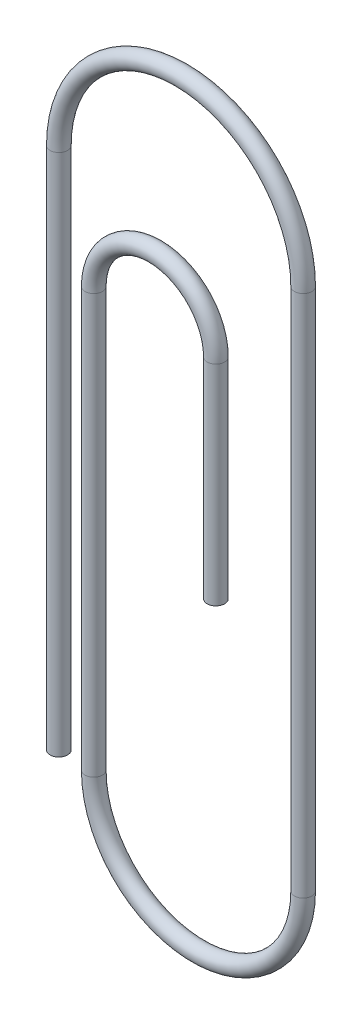
ISO-10303-21;
HEADER;
FILE_DESCRIPTION(('STEP AP214'),'2;1');
FILE_NAME('part.step','',(''),(''),'','','');
FILE_SCHEMA(('AUTOMOTIVE_DESIGN { 1 0 10303 214 1 1 1 1 }'));
ENDSEC;
DATA;
#1=APPLICATION_CONTEXT('core data for automotive mechanical design processes');
#2=APPLICATION_PROTOCOL_DEFINITION('international standard','automotive_design',2000,#1);
#3=PRODUCT_CONTEXT('',#1,'mechanical');
#4=PRODUCT('Part','Part','',(#3));
#5=PRODUCT_RELATED_PRODUCT_CATEGORY('part','',(#4));
#6=PRODUCT_DEFINITION_FORMATION('','',#4);
#7=PRODUCT_DEFINITION_CONTEXT('part definition',#1,'design');
#8=PRODUCT_DEFINITION('design','',#6,#7);
#9=PRODUCT_DEFINITION_SHAPE('','',#8);
#10=(LENGTH_UNIT() NAMED_UNIT(*) SI_UNIT(.MILLI.,.METRE.));
#11=(NAMED_UNIT(*) PLANE_ANGLE_UNIT() SI_UNIT($,.RADIAN.));
#12=(NAMED_UNIT(*) SI_UNIT($,.STERADIAN.) SOLID_ANGLE_UNIT());
#13=UNCERTAINTY_MEASURE_WITH_UNIT(LENGTH_MEASURE(1.E-05),#10,'distance_accuracy_value','');
#14=(GEOMETRIC_REPRESENTATION_CONTEXT(3) GLOBAL_UNCERTAINTY_ASSIGNED_CONTEXT((#13)) GLOBAL_UNIT_ASSIGNED_CONTEXT((#10,
#11,#12)) REPRESENTATION_CONTEXT('',''));
#15=CARTESIAN_POINT('',(0.,0.,0.));
#16=DIRECTION('',(0.,0.,1.));
#17=DIRECTION('',(1.,0.,0.));
#18=AXIS2_PLACEMENT_3D('',#15,#16,#17);
#19=CARTESIAN_POINT('',(-38.6158192090395,-48.1920903954802,0.));
#20=DIRECTION('',(0.,-1.,0.));
#21=DIRECTION('',(0.,0.,1.));
#22=AXIS2_PLACEMENT_3D('',#19,#20,#21);
#23=PLANE('',#22);
#24=CARTESIAN_POINT('',(-38.6158192090395,-48.1920903954802,0.));
#25=DIRECTION('',(0.,-1.,0.));
#26=DIRECTION('',(0.,0.,1.));
#27=AXIS2_PLACEMENT_3D('',#24,#25,#26);
#28=CIRCLE('',#27,2.5);
#29=CARTESIAN_POINT('',(-38.6158192090395,-48.1920903954802,2.5));
#30=VERTEX_POINT('',#29);
#31=EDGE_CURVE('E71',#30,#30,#28,.T.);
#32=ORIENTED_EDGE('',*,*,#31,.T.);
#33=EDGE_LOOP('',(#32));
#34=FACE_BOUND('',#33,.T.);
#35=ADVANCED_FACE('F43',(#34),#23,.T.);
#36=CARTESIAN_POINT('',(-83.6158192090396,-108.19209039548,0.));
#37=DIRECTION('',(0.,1.,0.));
#38=DIRECTION('',(0.,0.,1.));
#39=AXIS2_PLACEMENT_3D('',#36,#37,#38);
#40=PLANE('',#39);
#41=CARTESIAN_POINT('',(-83.6158192090396,-108.19209039548,0.));
#42=DIRECTION('',(0.,1.,0.));
#43=DIRECTION('',(0.,0.,1.));
#44=AXIS2_PLACEMENT_3D('',#41,#42,#43);
#45=CIRCLE('',#44,2.5);
#46=CARTESIAN_POINT('',(-83.6158192090396,-108.19209039548,2.5));
#47=VERTEX_POINT('',#46);
#48=EDGE_CURVE('E11',#47,#47,#45,.T.);
#49=ORIENTED_EDGE('',*,*,#48,.F.);
#50=EDGE_LOOP('',(#49));
#51=FACE_BOUND('',#50,.T.);
#52=ADVANCED_FACE('F79',(#51),#40,.F.);
#53=CARTESIAN_POINT('',(-38.6158192090395,-48.1920903954802,0.));
#54=DIRECTION('',(0.,1.,0.));
#55=DIRECTION('',(-1.,0.,0.));
#56=AXIS2_PLACEMENT_3D('',#53,#54,#55);
#57=CYLINDRICAL_SURFACE('',#56,2.5);
#58=CARTESIAN_POINT('',(-38.6158192090395,11.8079096045198,0.));
#59=DIRECTION('',(0.,-1.,0.));
#60=DIRECTION('',(0.,0.,1.));
#61=AXIS2_PLACEMENT_3D('',#58,#59,#60);
#62=CIRCLE('',#61,2.5);
#63=CARTESIAN_POINT('',(-36.1158192090395,11.8079096045198,0.));
#64=VERTEX_POINT('',#63);
#65=EDGE_CURVE('E68',#64,#64,#62,.T.);
#66=ORIENTED_EDGE('',*,*,#65,.T.);
#67=EDGE_LOOP('',(#66));
#68=FACE_BOUND('',#67,.T.);
#69=ORIENTED_EDGE('',*,*,#31,.F.);
#70=EDGE_LOOP('',(#69));
#71=FACE_BOUND('',#70,.T.);
#72=ADVANCED_FACE('F76',(#68,#71),#57,.T.);
#73=CARTESIAN_POINT('',(-56.1158192090395,11.8079096045198,0.));
#74=DIRECTION('',(0.,0.,1.));
#75=DIRECTION('',(1.,0.,0.));
#76=AXIS2_PLACEMENT_3D('',#73,#74,#75);
#77=TOROIDAL_SURFACE('',#76,17.5,2.5);
#78=CARTESIAN_POINT('',(-73.6158192090395,11.8079096045197,0.));
#79=DIRECTION('',(0.,1.,0.));
#80=DIRECTION('',(0.,0.,1.));
#81=AXIS2_PLACEMENT_3D('',#78,#79,#80);
#82=CIRCLE('',#81,2.5);
#83=CARTESIAN_POINT('',(-76.1158192090395,11.8079096045197,0.));
#84=VERTEX_POINT('',#83);
#85=EDGE_CURVE('E65',#84,#84,#82,.T.);
#86=CARTESIAN_POINT('',(-56.1158192090395,11.8079096045198,0.));
#87=DIRECTION('',(0.,0.,1.));
#88=DIRECTION('',(1.,0.,0.));
#89=AXIS2_PLACEMENT_3D('',#86,#87,#88);
#90=CIRCLE('',#89,20.);
#91=EDGE_CURVE('',#64,#84,#90,.T.);
#92=ORIENTED_EDGE('',*,*,#65,.F.);
#93=ORIENTED_EDGE('',*,*,#85,.T.);
#94=ORIENTED_EDGE('',*,*,#91,.T.);
#95=ORIENTED_EDGE('',*,*,#91,.F.);
#96=EDGE_LOOP('',(#92,#94,#93,#95));
#97=FACE_BOUND('',#96,.T.);
#98=ADVANCED_FACE('F78',(#97),#77,.T.);
#99=CARTESIAN_POINT('',(-73.6158192090395,11.8079096045198,0.));
#100=DIRECTION('',(0.,-1.,0.));
#101=DIRECTION('',(0.,0.,-1.));
#102=AXIS2_PLACEMENT_3D('',#99,#100,#101);
#103=CYLINDRICAL_SURFACE('',#102,2.5);
#104=CARTESIAN_POINT('',(-73.6158192090395,-108.19209039548,0.));
#105=DIRECTION('',(0.,1.,0.));
#106=DIRECTION('',(0.,0.,1.));
#107=AXIS2_PLACEMENT_3D('',#104,#105,#106);
#108=CIRCLE('',#107,2.5);
#109=CARTESIAN_POINT('',(-76.1158192090396,-108.19209039548,0.));
#110=VERTEX_POINT('',#109);
#111=EDGE_CURVE('E62',#110,#110,#108,.T.);
#112=ORIENTED_EDGE('',*,*,#111,.T.);
#113=EDGE_LOOP('',(#112));
#114=FACE_BOUND('',#113,.T.);
#115=ORIENTED_EDGE('',*,*,#85,.F.);
#116=EDGE_LOOP('',(#115));
#117=FACE_BOUND('',#116,.T.);
#118=ADVANCED_FACE('F86',(#114,#117),#103,.T.);
#119=CARTESIAN_POINT('',(-43.6158192090395,-108.19209039548,0.));
#120=DIRECTION('',(0.,0.,1.));
#121=DIRECTION('',(1.,0.,0.));
#122=AXIS2_PLACEMENT_3D('',#119,#120,#121);
#123=TOROIDAL_SURFACE('',#122,30.,2.5);
#124=CARTESIAN_POINT('',(-13.6158192090396,-108.19209039548,0.));
#125=DIRECTION('',(0.,-1.,0.));
#126=DIRECTION('',(0.,0.,1.));
#127=AXIS2_PLACEMENT_3D('',#124,#125,#126);
#128=CIRCLE('',#127,2.5);
#129=CARTESIAN_POINT('',(-11.1158192090395,-108.19209039548,0.));
#130=VERTEX_POINT('',#129);
#131=EDGE_CURVE('E57',#130,#130,#128,.T.);
#132=CARTESIAN_POINT('',(-43.6158192090395,-108.19209039548,0.));
#133=DIRECTION('',(0.,0.,1.));
#134=DIRECTION('',(1.,0.,0.));
#135=AXIS2_PLACEMENT_3D('',#132,#133,#134);
#136=CIRCLE('',#135,32.5);
#137=EDGE_CURVE('',#110,#130,#136,.T.);
#138=ORIENTED_EDGE('',*,*,#111,.F.);
#139=ORIENTED_EDGE('',*,*,#131,.T.);
#140=ORIENTED_EDGE('',*,*,#137,.T.);
#141=ORIENTED_EDGE('',*,*,#137,.F.);
#142=EDGE_LOOP('',(#138,#140,#139,#141));
#143=FACE_BOUND('',#142,.T.);
#144=ADVANCED_FACE('F103',(#143),#123,.T.);
#145=CARTESIAN_POINT('',(-13.6158192090396,-108.19209039548,0.));
#146=DIRECTION('',(0.,1.,0.));
#147=DIRECTION('',(-1.,0.,0.));
#148=AXIS2_PLACEMENT_3D('',#145,#146,#147);
#149=CYLINDRICAL_SURFACE('',#148,2.5);
#150=CARTESIAN_POINT('',(-13.6158192090396,41.8079096045198,0.));
#151=DIRECTION('',(0.,-1.,0.));
#152=DIRECTION('',(0.,0.,1.));
#153=AXIS2_PLACEMENT_3D('',#150,#151,#152);
#154=CIRCLE('',#153,2.5);
#155=CARTESIAN_POINT('',(-11.1158192090396,41.8079096045198,0.));
#156=VERTEX_POINT('',#155);
#157=EDGE_CURVE('E53',#156,#156,#154,.T.);
#158=ORIENTED_EDGE('',*,*,#157,.T.);
#159=EDGE_LOOP('',(#158));
#160=FACE_BOUND('',#159,.T.);
#161=ORIENTED_EDGE('',*,*,#131,.F.);
#162=EDGE_LOOP('',(#161));
#163=FACE_BOUND('',#162,.T.);
#164=ADVANCED_FACE('F97',(#160,#163),#149,.T.);
#165=CARTESIAN_POINT('',(-48.6158192090396,41.8079096045198,0.));
#166=DIRECTION('',(0.,0.,1.));
#167=DIRECTION('',(1.,0.,0.));
#168=AXIS2_PLACEMENT_3D('',#165,#166,#167);
#169=TOROIDAL_SURFACE('',#168,35.,2.5);
#170=CARTESIAN_POINT('',(-83.6158192090395,41.8079096045198,0.));
#171=DIRECTION('',(0.,1.,0.));
#172=DIRECTION('',(0.,0.,1.));
#173=AXIS2_PLACEMENT_3D('',#170,#171,#172);
#174=CIRCLE('',#173,2.5);
#175=CARTESIAN_POINT('',(-86.1158192090396,41.8079096045198,0.));
#176=VERTEX_POINT('',#175);
#177=EDGE_CURVE('E49',#176,#176,#174,.T.);
#178=CARTESIAN_POINT('',(-48.6158192090396,41.8079096045198,0.));
#179=DIRECTION('',(0.,0.,1.));
#180=DIRECTION('',(1.,0.,0.));
#181=AXIS2_PLACEMENT_3D('',#178,#179,#180);
#182=CIRCLE('',#181,37.5);
#183=EDGE_CURVE('',#156,#176,#182,.T.);
#184=ORIENTED_EDGE('',*,*,#157,.F.);
#185=ORIENTED_EDGE('',*,*,#177,.T.);
#186=ORIENTED_EDGE('',*,*,#183,.T.);
#187=ORIENTED_EDGE('',*,*,#183,.F.);
#188=EDGE_LOOP('',(#184,#186,#185,#187));
#189=FACE_BOUND('',#188,.T.);
#190=ADVANCED_FACE('F92',(#189),#169,.T.);
#191=CARTESIAN_POINT('',(-83.6158192090396,41.8079096045198,0.));
#192=DIRECTION('',(0.,-1.,0.));
#193=DIRECTION('',(0.,0.,-1.));
#194=AXIS2_PLACEMENT_3D('',#191,#192,#193);
#195=CYLINDRICAL_SURFACE('',#194,2.5);
#196=ORIENTED_EDGE('',*,*,#48,.T.);
#197=EDGE_LOOP('',(#196));
#198=FACE_BOUND('',#197,.T.);
#199=ORIENTED_EDGE('',*,*,#177,.F.);
#200=EDGE_LOOP('',(#199));
#201=FACE_BOUND('',#200,.T.);
#202=ADVANCED_FACE('F90',(#198,#201),#195,.T.);
#203=CLOSED_SHELL('',(#35,#52,#72,#98,#118,#144,#164,#190,#202));
#204=MANIFOLD_SOLID_BREP('B2',#203);
#205=ADVANCED_BREP_SHAPE_REPRESENTATION('',(#18,#204),#14);
#206=SHAPE_DEFINITION_REPRESENTATION(#9,#205);
ENDSEC;
END-ISO-10303-21;
